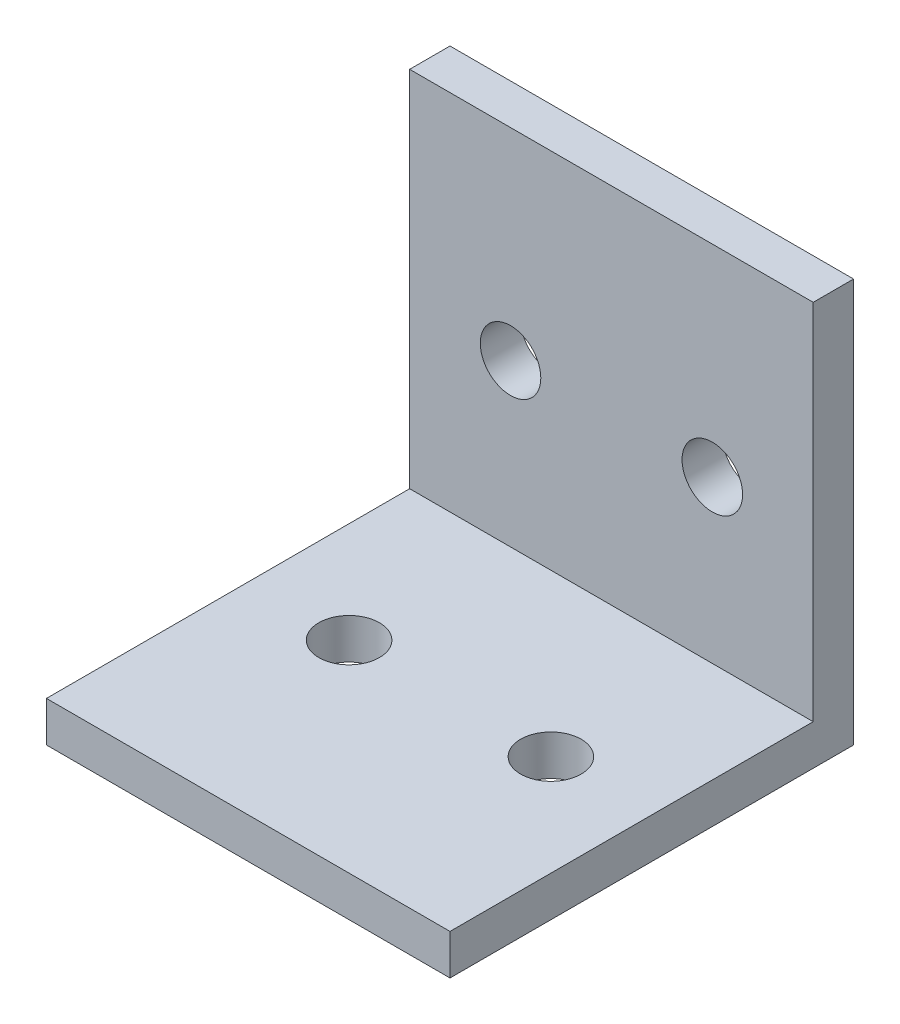
ISO-10303-21;
HEADER;
FILE_DESCRIPTION(('STEP AP214'),'2;1');
FILE_NAME('part.step','',(''),(''),'','','');
FILE_SCHEMA(('AUTOMOTIVE_DESIGN { 1 0 10303 214 1 1 1 1 }'));
ENDSEC;
DATA;
#1=APPLICATION_CONTEXT('core data for automotive mechanical design processes');
#2=APPLICATION_PROTOCOL_DEFINITION('international standard','automotive_design',2000,#1);
#3=PRODUCT_CONTEXT('',#1,'mechanical');
#4=PRODUCT('Part','Part','',(#3));
#5=PRODUCT_RELATED_PRODUCT_CATEGORY('part','',(#4));
#6=PRODUCT_DEFINITION_FORMATION('','',#4);
#7=PRODUCT_DEFINITION_CONTEXT('part definition',#1,'design');
#8=PRODUCT_DEFINITION('design','',#6,#7);
#9=PRODUCT_DEFINITION_SHAPE('','',#8);
#10=(LENGTH_UNIT() NAMED_UNIT(*) SI_UNIT(.MILLI.,.METRE.));
#11=(NAMED_UNIT(*) PLANE_ANGLE_UNIT() SI_UNIT($,.RADIAN.));
#12=(NAMED_UNIT(*) SI_UNIT($,.STERADIAN.) SOLID_ANGLE_UNIT());
#13=UNCERTAINTY_MEASURE_WITH_UNIT(LENGTH_MEASURE(1.E-05),#10,'distance_accuracy_value','');
#14=(GEOMETRIC_REPRESENTATION_CONTEXT(3) GLOBAL_UNCERTAINTY_ASSIGNED_CONTEXT((#13)) GLOBAL_UNIT_ASSIGNED_CONTEXT((#10,
#11,#12)) REPRESENTATION_CONTEXT('',''));
#15=CARTESIAN_POINT('',(0.,0.,0.));
#16=DIRECTION('',(0.,0.,1.));
#17=DIRECTION('',(1.,0.,0.));
#18=AXIS2_PLACEMENT_3D('',#15,#16,#17);
#19=CARTESIAN_POINT('',(10.,10.,2.));
#20=DIRECTION('',(-1.,0.,0.));
#21=DIRECTION('',(0.,-1.,0.));
#22=AXIS2_PLACEMENT_3D('',#19,#20,#21);
#23=PLANE('',#22);
#24=DIRECTION('',(0.,1.,0.));
#25=VECTOR('',#24,1.);
#26=CARTESIAN_POINT('',(10.,10.,0.));
#27=LINE('',#26,#25);
#28=CARTESIAN_POINT('',(10.,-10.,0.));
#29=VERTEX_POINT('',#28);
#30=CARTESIAN_POINT('',(10.,10.,0.));
#31=VERTEX_POINT('',#30);
#32=EDGE_CURVE('E96',#29,#31,#27,.T.);
#33=ORIENTED_EDGE('',*,*,#32,.T.);
#34=DIRECTION('',(0.,0.,-1.));
#35=VECTOR('',#34,1.);
#36=CARTESIAN_POINT('',(10.,10.,2.));
#37=LINE('',#36,#35);
#38=CARTESIAN_POINT('',(10.,10.,2.));
#39=VERTEX_POINT('',#38);
#40=EDGE_CURVE('E11',#39,#31,#37,.T.);
#41=ORIENTED_EDGE('',*,*,#40,.F.);
#42=DIRECTION('',(0.,1.,0.));
#43=VECTOR('',#42,1.);
#44=CARTESIAN_POINT('',(10.,10.,2.));
#45=LINE('',#44,#43);
#46=CARTESIAN_POINT('',(10.,-8.,2.));
#47=VERTEX_POINT('',#46);
#48=EDGE_CURVE('E89',#47,#39,#45,.T.);
#49=ORIENTED_EDGE('',*,*,#48,.F.);
#50=DIRECTION('',(0.,0.,-1.));
#51=VECTOR('',#50,1.);
#52=CARTESIAN_POINT('',(10.,-8.,20.));
#53=LINE('',#52,#51);
#54=CARTESIAN_POINT('',(10.,-8.,20.));
#55=VERTEX_POINT('',#54);
#56=EDGE_CURVE('E104',#55,#47,#53,.T.);
#57=ORIENTED_EDGE('',*,*,#56,.F.);
#58=DIRECTION('',(0.,1.,0.));
#59=VECTOR('',#58,1.);
#60=CARTESIAN_POINT('',(10.,-10.,20.));
#61=LINE('',#60,#59);
#62=CARTESIAN_POINT('',(10.,-10.,20.));
#63=VERTEX_POINT('',#62);
#64=EDGE_CURVE('E99',#63,#55,#61,.T.);
#65=ORIENTED_EDGE('',*,*,#64,.F.);
#66=DIRECTION('',(0.,0.,-1.));
#67=VECTOR('',#66,1.);
#68=CARTESIAN_POINT('',(10.,-10.,2.));
#69=LINE('',#68,#67);
#70=EDGE_CURVE('E82',#63,#29,#69,.T.);
#71=ORIENTED_EDGE('',*,*,#70,.T.);
#72=EDGE_LOOP('',(#33,#41,#49,#57,#65,#71));
#73=FACE_BOUND('',#72,.T.);
#74=ADVANCED_FACE('F35',(#73),#23,.F.);
#75=CARTESIAN_POINT('',(-10.,10.,2.));
#76=DIRECTION('',(0.,-1.,0.));
#77=DIRECTION('',(0.,0.,-1.));
#78=AXIS2_PLACEMENT_3D('',#75,#76,#77);
#79=PLANE('',#78);
#80=DIRECTION('',(-1.,0.,0.));
#81=VECTOR('',#80,1.);
#82=CARTESIAN_POINT('',(-10.,10.,0.));
#83=LINE('',#82,#81);
#84=CARTESIAN_POINT('',(-10.,10.,0.));
#85=VERTEX_POINT('',#84);
#86=EDGE_CURVE('E103',#31,#85,#83,.T.);
#87=ORIENTED_EDGE('',*,*,#86,.T.);
#88=DIRECTION('',(0.,0.,-1.));
#89=VECTOR('',#88,1.);
#90=CARTESIAN_POINT('',(-10.,10.,2.));
#91=LINE('',#90,#89);
#92=CARTESIAN_POINT('',(-10.,10.,2.));
#93=VERTEX_POINT('',#92);
#94=EDGE_CURVE('E43',#93,#85,#91,.T.);
#95=ORIENTED_EDGE('',*,*,#94,.F.);
#96=DIRECTION('',(-1.,0.,0.));
#97=VECTOR('',#96,1.);
#98=CARTESIAN_POINT('',(-10.,10.,2.));
#99=LINE('',#98,#97);
#100=EDGE_CURVE('E57',#39,#93,#99,.T.);
#101=ORIENTED_EDGE('',*,*,#100,.F.);
#102=ORIENTED_EDGE('',*,*,#40,.T.);
#103=EDGE_LOOP('',(#87,#95,#101,#102));
#104=FACE_BOUND('',#103,.T.);
#105=ADVANCED_FACE('F161',(#104),#79,.F.);
#106=CARTESIAN_POINT('',(-10.,10.,2.));
#107=DIRECTION('',(1.,0.,0.));
#108=DIRECTION('',(0.,0.,-1.));
#109=AXIS2_PLACEMENT_3D('',#106,#107,#108);
#110=PLANE('',#109);
#111=DIRECTION('',(0.,-1.,0.));
#112=VECTOR('',#111,1.);
#113=CARTESIAN_POINT('',(-10.,10.,0.));
#114=LINE('',#113,#112);
#115=CARTESIAN_POINT('',(-10.,-10.,0.));
#116=VERTEX_POINT('',#115);
#117=EDGE_CURVE('E90',#85,#116,#114,.T.);
#118=ORIENTED_EDGE('',*,*,#117,.T.);
#119=DIRECTION('',(0.,0.,-1.));
#120=VECTOR('',#119,1.);
#121=CARTESIAN_POINT('',(-10.,-10.,2.));
#122=LINE('',#121,#120);
#123=CARTESIAN_POINT('',(-10.,-10.,20.));
#124=VERTEX_POINT('',#123);
#125=EDGE_CURVE('E85',#124,#116,#122,.T.);
#126=ORIENTED_EDGE('',*,*,#125,.F.);
#127=DIRECTION('',(0.,-1.,0.));
#128=VECTOR('',#127,1.);
#129=CARTESIAN_POINT('',(-10.,-10.,20.));
#130=LINE('',#129,#128);
#131=CARTESIAN_POINT('',(-10.,-8.,20.));
#132=VERTEX_POINT('',#131);
#133=EDGE_CURVE('E121',#132,#124,#130,.T.);
#134=ORIENTED_EDGE('',*,*,#133,.F.);
#135=DIRECTION('',(0.,0.,-1.));
#136=VECTOR('',#135,1.);
#137=CARTESIAN_POINT('',(-10.,-8.,20.));
#138=LINE('',#137,#136);
#139=CARTESIAN_POINT('',(-10.,-8.,2.));
#140=VERTEX_POINT('',#139);
#141=EDGE_CURVE('E108',#132,#140,#138,.T.);
#142=ORIENTED_EDGE('',*,*,#141,.T.);
#143=DIRECTION('',(0.,-1.,0.));
#144=VECTOR('',#143,1.);
#145=CARTESIAN_POINT('',(-10.,10.,2.));
#146=LINE('',#145,#144);
#147=EDGE_CURVE('E100',#93,#140,#146,.T.);
#148=ORIENTED_EDGE('',*,*,#147,.F.);
#149=ORIENTED_EDGE('',*,*,#94,.T.);
#150=EDGE_LOOP('',(#118,#126,#134,#142,#148,#149));
#151=FACE_BOUND('',#150,.T.);
#152=ADVANCED_FACE('F152',(#151),#110,.F.);
#153=CARTESIAN_POINT('',(-10.,-10.,2.));
#154=DIRECTION('',(0.,1.,0.));
#155=DIRECTION('',(0.,0.,1.));
#156=AXIS2_PLACEMENT_3D('',#153,#154,#155);
#157=PLANE('',#156);
#158=CARTESIAN_POINT('',(5.,-10.,10.));
#159=DIRECTION('',(0.,-1.,0.));
#160=DIRECTION('',(0.,0.,-1.));
#161=AXIS2_PLACEMENT_3D('',#158,#159,#160);
#162=CIRCLE('',#161,1.5);
#163=CARTESIAN_POINT('',(5.,-10.,8.5));
#164=VERTEX_POINT('',#163);
#165=EDGE_CURVE('E128',#164,#164,#162,.T.);
#166=ORIENTED_EDGE('',*,*,#165,.F.);
#167=EDGE_LOOP('',(#166));
#168=FACE_BOUND('',#167,.T.);
#169=CARTESIAN_POINT('',(-5.,-10.,10.));
#170=DIRECTION('',(0.,-1.,0.));
#171=DIRECTION('',(0.,0.,-1.));
#172=AXIS2_PLACEMENT_3D('',#169,#170,#171);
#173=CIRCLE('',#172,1.5);
#174=CARTESIAN_POINT('',(-5.,-10.,8.5));
#175=VERTEX_POINT('',#174);
#176=EDGE_CURVE('E118',#175,#175,#173,.T.);
#177=ORIENTED_EDGE('',*,*,#176,.F.);
#178=EDGE_LOOP('',(#177));
#179=FACE_BOUND('',#178,.T.);
#180=DIRECTION('',(1.,0.,0.));
#181=VECTOR('',#180,1.);
#182=CARTESIAN_POINT('',(-10.,-10.,0.));
#183=LINE('',#182,#181);
#184=EDGE_CURVE('E77',#116,#29,#183,.T.);
#185=ORIENTED_EDGE('',*,*,#184,.T.);
#186=ORIENTED_EDGE('',*,*,#70,.F.);
#187=DIRECTION('',(1.,0.,0.));
#188=VECTOR('',#187,1.);
#189=CARTESIAN_POINT('',(-10.,-10.,20.));
#190=LINE('',#189,#188);
#191=EDGE_CURVE('E134',#124,#63,#190,.T.);
#192=ORIENTED_EDGE('',*,*,#191,.F.);
#193=ORIENTED_EDGE('',*,*,#125,.T.);
#194=EDGE_LOOP('',(#185,#186,#192,#193));
#195=FACE_BOUND('',#194,.T.);
#196=ADVANCED_FACE('F79',(#168,#179,#195),#157,.F.);
#197=CARTESIAN_POINT('',(0.,0.,2.));
#198=DIRECTION('',(0.,0.,1.));
#199=DIRECTION('',(1.,0.,0.));
#200=AXIS2_PLACEMENT_3D('',#197,#198,#199);
#201=PLANE('',#200);
#202=CARTESIAN_POINT('',(5.,0.,2.));
#203=DIRECTION('',(0.,0.,1.));
#204=DIRECTION('',(1.,0.,0.));
#205=AXIS2_PLACEMENT_3D('',#202,#203,#204);
#206=CIRCLE('',#205,1.5);
#207=CARTESIAN_POINT('',(6.5,0.,2.));
#208=VERTEX_POINT('',#207);
#209=EDGE_CURVE('E202',#208,#208,#206,.T.);
#210=ORIENTED_EDGE('',*,*,#209,.F.);
#211=EDGE_LOOP('',(#210));
#212=FACE_BOUND('',#211,.T.);
#213=CARTESIAN_POINT('',(-5.,0.,2.));
#214=DIRECTION('',(0.,0.,1.));
#215=DIRECTION('',(1.,0.,0.));
#216=AXIS2_PLACEMENT_3D('',#213,#214,#215);
#217=CIRCLE('',#216,1.5);
#218=CARTESIAN_POINT('',(-3.5,0.,2.));
#219=VERTEX_POINT('',#218);
#220=EDGE_CURVE('E211',#219,#219,#217,.T.);
#221=ORIENTED_EDGE('',*,*,#220,.F.);
#222=EDGE_LOOP('',(#221));
#223=FACE_BOUND('',#222,.T.);
#224=DIRECTION('',(-1.,0.,0.));
#225=VECTOR('',#224,1.);
#226=CARTESIAN_POINT('',(-10.,-8.,2.));
#227=LINE('',#226,#225);
#228=EDGE_CURVE('E51',#47,#140,#227,.T.);
#229=ORIENTED_EDGE('',*,*,#228,.F.);
#230=ORIENTED_EDGE('',*,*,#48,.T.);
#231=ORIENTED_EDGE('',*,*,#100,.T.);
#232=ORIENTED_EDGE('',*,*,#147,.T.);
#233=EDGE_LOOP('',(#229,#230,#231,#232));
#234=FACE_BOUND('',#233,.T.);
#235=ADVANCED_FACE('F144',(#212,#223,#234),#201,.T.);
#236=CARTESIAN_POINT('',(0.,0.,0.));
#237=DIRECTION('',(0.,0.,1.));
#238=DIRECTION('',(1.,0.,0.));
#239=AXIS2_PLACEMENT_3D('',#236,#237,#238);
#240=PLANE('',#239);
#241=CARTESIAN_POINT('',(5.,0.,0.));
#242=DIRECTION('',(0.,0.,-1.));
#243=DIRECTION('',(-1.,0.,0.));
#244=AXIS2_PLACEMENT_3D('',#241,#242,#243);
#245=CIRCLE('',#244,1.5);
#246=CARTESIAN_POINT('',(3.5,0.,0.));
#247=VERTEX_POINT('',#246);
#248=EDGE_CURVE('E205',#247,#247,#245,.T.);
#249=ORIENTED_EDGE('',*,*,#248,.F.);
#250=EDGE_LOOP('',(#249));
#251=FACE_BOUND('',#250,.T.);
#252=CARTESIAN_POINT('',(-5.,0.,0.));
#253=DIRECTION('',(0.,0.,-1.));
#254=DIRECTION('',(-1.,0.,0.));
#255=AXIS2_PLACEMENT_3D('',#252,#253,#254);
#256=CIRCLE('',#255,1.5);
#257=CARTESIAN_POINT('',(-6.5,0.,0.));
#258=VERTEX_POINT('',#257);
#259=EDGE_CURVE('E207',#258,#258,#256,.T.);
#260=ORIENTED_EDGE('',*,*,#259,.F.);
#261=EDGE_LOOP('',(#260));
#262=FACE_BOUND('',#261,.T.);
#263=ORIENTED_EDGE('',*,*,#32,.F.);
#264=ORIENTED_EDGE('',*,*,#184,.F.);
#265=ORIENTED_EDGE('',*,*,#117,.F.);
#266=ORIENTED_EDGE('',*,*,#86,.F.);
#267=EDGE_LOOP('',(#263,#264,#265,#266));
#268=FACE_BOUND('',#267,.T.);
#269=ADVANCED_FACE('F102',(#251,#262,#268),#240,.F.);
#270=CARTESIAN_POINT('',(-10.,-8.,20.));
#271=DIRECTION('',(0.,-1.,0.));
#272=DIRECTION('',(0.,0.,-1.));
#273=AXIS2_PLACEMENT_3D('',#270,#271,#272);
#274=PLANE('',#273);
#275=CARTESIAN_POINT('',(5.,-8.,10.));
#276=DIRECTION('',(0.,-1.,0.));
#277=DIRECTION('',(0.,0.,-1.));
#278=AXIS2_PLACEMENT_3D('',#275,#276,#277);
#279=CIRCLE('',#278,1.5);
#280=CARTESIAN_POINT('',(5.,-8.,8.5));
#281=VERTEX_POINT('',#280);
#282=EDGE_CURVE('E38',#281,#281,#279,.T.);
#283=ORIENTED_EDGE('',*,*,#282,.T.);
#284=EDGE_LOOP('',(#283));
#285=FACE_BOUND('',#284,.T.);
#286=CARTESIAN_POINT('',(-5.,-8.,10.));
#287=DIRECTION('',(0.,-1.,0.));
#288=DIRECTION('',(0.,0.,-1.));
#289=AXIS2_PLACEMENT_3D('',#286,#287,#288);
#290=CIRCLE('',#289,1.5);
#291=CARTESIAN_POINT('',(-5.,-8.,8.5));
#292=VERTEX_POINT('',#291);
#293=EDGE_CURVE('E116',#292,#292,#290,.T.);
#294=ORIENTED_EDGE('',*,*,#293,.T.);
#295=EDGE_LOOP('',(#294));
#296=FACE_BOUND('',#295,.T.);
#297=ORIENTED_EDGE('',*,*,#228,.T.);
#298=ORIENTED_EDGE('',*,*,#141,.F.);
#299=DIRECTION('',(-1.,0.,0.));
#300=VECTOR('',#299,1.);
#301=CARTESIAN_POINT('',(-10.,-8.,20.));
#302=LINE('',#301,#300);
#303=EDGE_CURVE('E137',#55,#132,#302,.T.);
#304=ORIENTED_EDGE('',*,*,#303,.F.);
#305=ORIENTED_EDGE('',*,*,#56,.T.);
#306=EDGE_LOOP('',(#297,#298,#304,#305));
#307=FACE_BOUND('',#306,.T.);
#308=ADVANCED_FACE('F149',(#285,#296,#307),#274,.F.);
#309=CARTESIAN_POINT('',(0.,0.,20.));
#310=DIRECTION('',(0.,0.,-1.));
#311=DIRECTION('',(-1.,0.,0.));
#312=AXIS2_PLACEMENT_3D('',#309,#310,#311);
#313=PLANE('',#312);
#314=ORIENTED_EDGE('',*,*,#133,.T.);
#315=ORIENTED_EDGE('',*,*,#191,.T.);
#316=ORIENTED_EDGE('',*,*,#64,.T.);
#317=ORIENTED_EDGE('',*,*,#303,.T.);
#318=EDGE_LOOP('',(#314,#315,#316,#317));
#319=FACE_BOUND('',#318,.T.);
#320=ADVANCED_FACE('F156',(#319),#313,.F.);
#321=CARTESIAN_POINT('',(-5.,8.,10.));
#322=DIRECTION('',(0.,-1.,0.));
#323=DIRECTION('',(0.,0.,-1.));
#324=AXIS2_PLACEMENT_3D('',#321,#322,#323);
#325=CYLINDRICAL_SURFACE('',#324,1.5);
#326=ORIENTED_EDGE('',*,*,#176,.T.);
#327=EDGE_LOOP('',(#326));
#328=FACE_BOUND('',#327,.T.);
#329=ORIENTED_EDGE('',*,*,#293,.F.);
#330=EDGE_LOOP('',(#329));
#331=FACE_BOUND('',#330,.T.);
#332=ADVANCED_FACE('F183',(#328,#331),#325,.F.);
#333=CARTESIAN_POINT('',(5.,8.,10.));
#334=DIRECTION('',(0.,-1.,0.));
#335=DIRECTION('',(0.,0.,-1.));
#336=AXIS2_PLACEMENT_3D('',#333,#334,#335);
#337=CYLINDRICAL_SURFACE('',#336,1.5);
#338=ORIENTED_EDGE('',*,*,#165,.T.);
#339=EDGE_LOOP('',(#338));
#340=FACE_BOUND('',#339,.T.);
#341=ORIENTED_EDGE('',*,*,#282,.F.);
#342=EDGE_LOOP('',(#341));
#343=FACE_BOUND('',#342,.T.);
#344=ADVANCED_FACE('F186',(#340,#343),#337,.F.);
#345=CARTESIAN_POINT('',(-5.,0.,18.));
#346=DIRECTION('',(0.,0.,-1.));
#347=DIRECTION('',(-1.,0.,0.));
#348=AXIS2_PLACEMENT_3D('',#345,#346,#347);
#349=CYLINDRICAL_SURFACE('',#348,1.5);
#350=ORIENTED_EDGE('',*,*,#220,.T.);
#351=EDGE_LOOP('',(#350));
#352=FACE_BOUND('',#351,.T.);
#353=ORIENTED_EDGE('',*,*,#259,.T.);
#354=EDGE_LOOP('',(#353));
#355=FACE_BOUND('',#354,.T.);
#356=ADVANCED_FACE('F189',(#352,#355),#349,.F.);
#357=CARTESIAN_POINT('',(5.,0.,18.));
#358=DIRECTION('',(0.,0.,-1.));
#359=DIRECTION('',(-1.,0.,0.));
#360=AXIS2_PLACEMENT_3D('',#357,#358,#359);
#361=CYLINDRICAL_SURFACE('',#360,1.5);
#362=ORIENTED_EDGE('',*,*,#209,.T.);
#363=EDGE_LOOP('',(#362));
#364=FACE_BOUND('',#363,.T.);
#365=ORIENTED_EDGE('',*,*,#248,.T.);
#366=EDGE_LOOP('',(#365));
#367=FACE_BOUND('',#366,.T.);
#368=ADVANCED_FACE('F193',(#364,#367),#361,.F.);
#369=CLOSED_SHELL('',(#74,#105,#152,#196,#235,#269,#308,#320,#332,#344,#356,#368));
#370=MANIFOLD_SOLID_BREP('B2',#369);
#371=ADVANCED_BREP_SHAPE_REPRESENTATION('',(#18,#370),#14);
#372=SHAPE_DEFINITION_REPRESENTATION(#9,#371);
ENDSEC;
END-ISO-10303-21;
